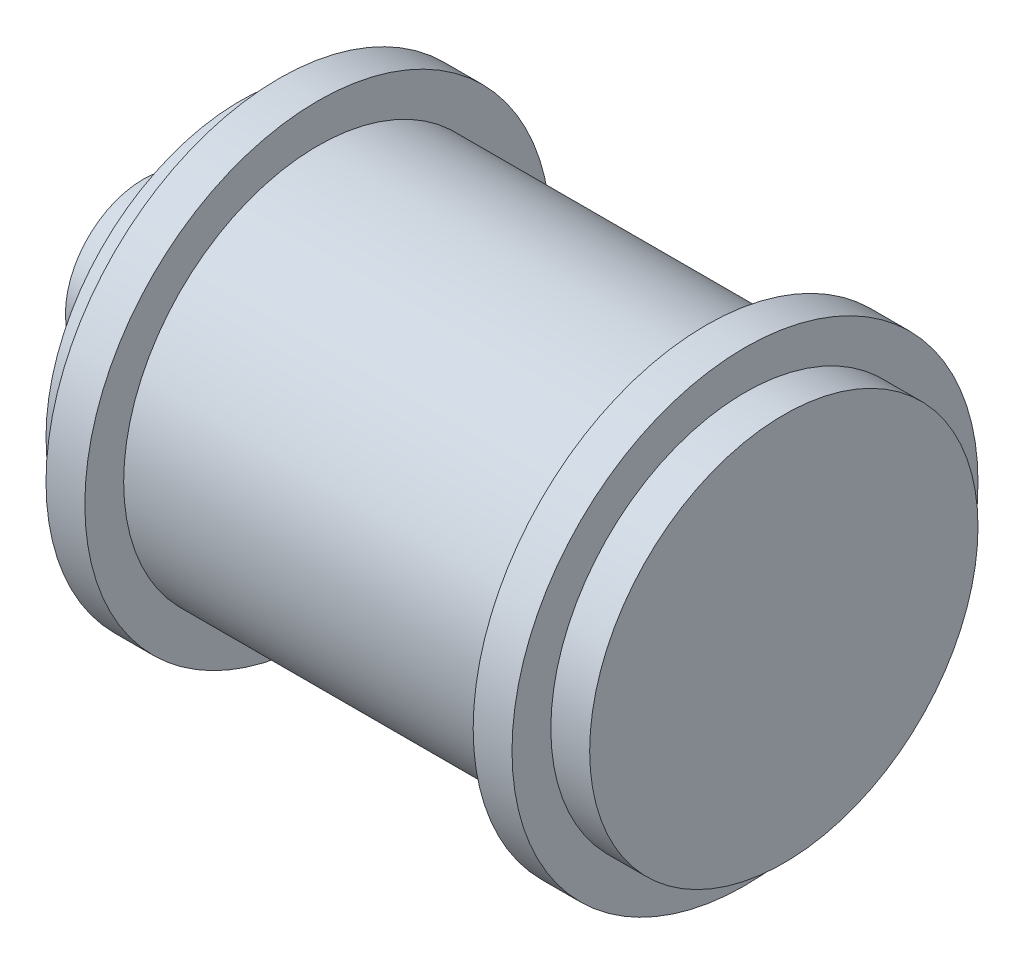
ISO-10303-21;
HEADER;
FILE_DESCRIPTION(('STEP AP214'),'2;1');
FILE_NAME('part.step','',(''),(''),'','','');
FILE_SCHEMA(('AUTOMOTIVE_DESIGN { 1 0 10303 214 1 1 1 1 }'));
ENDSEC;
DATA;
#1=APPLICATION_CONTEXT('core data for automotive mechanical design processes');
#2=APPLICATION_PROTOCOL_DEFINITION('international standard','automotive_design',2000,#1);
#3=PRODUCT_CONTEXT('',#1,'mechanical');
#4=PRODUCT('Part','Part','',(#3));
#5=PRODUCT_RELATED_PRODUCT_CATEGORY('part','',(#4));
#6=PRODUCT_DEFINITION_FORMATION('','',#4);
#7=PRODUCT_DEFINITION_CONTEXT('part definition',#1,'design');
#8=PRODUCT_DEFINITION('design','',#6,#7);
#9=PRODUCT_DEFINITION_SHAPE('','',#8);
#10=(LENGTH_UNIT() NAMED_UNIT(*) SI_UNIT(.MILLI.,.METRE.));
#11=(NAMED_UNIT(*) PLANE_ANGLE_UNIT() SI_UNIT($,.RADIAN.));
#12=(NAMED_UNIT(*) SI_UNIT($,.STERADIAN.) SOLID_ANGLE_UNIT());
#13=UNCERTAINTY_MEASURE_WITH_UNIT(LENGTH_MEASURE(1.E-05),#10,'distance_accuracy_value','');
#14=(GEOMETRIC_REPRESENTATION_CONTEXT(3) GLOBAL_UNCERTAINTY_ASSIGNED_CONTEXT((#13)) GLOBAL_UNIT_ASSIGNED_CONTEXT((#10,
#11,#12)) REPRESENTATION_CONTEXT('',''));
#15=CARTESIAN_POINT('',(0.,0.,0.));
#16=DIRECTION('',(0.,0.,1.));
#17=DIRECTION('',(1.,0.,0.));
#18=AXIS2_PLACEMENT_3D('',#15,#16,#17);
#19=CARTESIAN_POINT('',(140.,0.,0.));
#20=DIRECTION('',(-1.,0.,0.));
#21=DIRECTION('',(0.,0.,1.));
#22=AXIS2_PLACEMENT_3D('',#19,#20,#21);
#23=CYLINDRICAL_SURFACE('',#22,50.);
#24=CARTESIAN_POINT('',(10.,0.,0.));
#25=DIRECTION('',(1.,0.,0.));
#26=DIRECTION('',(0.,0.,-1.));
#27=AXIS2_PLACEMENT_3D('',#24,#25,#26);
#28=CIRCLE('',#27,50.);
#29=CARTESIAN_POINT('',(10.,0.,-50.));
#30=VERTEX_POINT('',#29);
#31=EDGE_CURVE('E43',#30,#30,#28,.T.);
#32=ORIENTED_EDGE('',*,*,#31,.F.);
#33=EDGE_LOOP('',(#32));
#34=FACE_BOUND('',#33,.T.);
#35=CARTESIAN_POINT('',(0.,0.,0.));
#36=DIRECTION('',(-1.,0.,0.));
#37=DIRECTION('',(0.,0.,1.));
#38=AXIS2_PLACEMENT_3D('',#35,#36,#37);
#39=CIRCLE('',#38,50.);
#40=CARTESIAN_POINT('',(0.,0.,50.));
#41=VERTEX_POINT('',#40);
#42=EDGE_CURVE('E34',#41,#41,#39,.T.);
#43=ORIENTED_EDGE('',*,*,#42,.F.);
#44=EDGE_LOOP('',(#43));
#45=FACE_BOUND('',#44,.T.);
#46=ADVANCED_FACE('F31',(#34,#45),#23,.T.);
#47=CARTESIAN_POINT('',(20.,0.,0.));
#48=DIRECTION('',(-1.,0.,0.));
#49=DIRECTION('',(0.,0.,1.));
#50=AXIS2_PLACEMENT_3D('',#47,#48,#49);
#51=CIRCLE('',#50,50.);
#52=CARTESIAN_POINT('',(20.,0.,50.));
#53=VERTEX_POINT('',#52);
#54=EDGE_CURVE('E72',#53,#53,#51,.T.);
#55=ORIENTED_EDGE('',*,*,#54,.F.);
#56=EDGE_LOOP('',(#55));
#57=FACE_BOUND('',#56,.T.);
#58=CARTESIAN_POINT('',(120.,0.,0.));
#59=DIRECTION('',(1.,0.,0.));
#60=DIRECTION('',(0.,0.,-1.));
#61=AXIS2_PLACEMENT_3D('',#58,#59,#60);
#62=CIRCLE('',#61,50.);
#63=CARTESIAN_POINT('',(120.,0.,-50.));
#64=VERTEX_POINT('',#63);
#65=EDGE_CURVE('E38',#64,#64,#62,.T.);
#66=ORIENTED_EDGE('',*,*,#65,.F.);
#67=EDGE_LOOP('',(#66));
#68=FACE_BOUND('',#67,.T.);
#69=ADVANCED_FACE('F82',(#57,#68),#23,.T.);
#70=CARTESIAN_POINT('',(0.,0.,0.));
#71=DIRECTION('',(-1.,0.,0.));
#72=DIRECTION('',(0.,0.,1.));
#73=AXIS2_PLACEMENT_3D('',#70,#71,#72);
#74=CYLINDRICAL_SURFACE('',#73,60.);
#75=CARTESIAN_POINT('',(10.,0.,0.));
#76=DIRECTION('',(-1.,0.,0.));
#77=DIRECTION('',(0.,0.,1.));
#78=AXIS2_PLACEMENT_3D('',#75,#76,#77);
#79=CIRCLE('',#78,60.);
#80=CARTESIAN_POINT('',(10.,0.,60.));
#81=VERTEX_POINT('',#80);
#82=EDGE_CURVE('E66',#81,#81,#79,.T.);
#83=ORIENTED_EDGE('',*,*,#82,.F.);
#84=EDGE_LOOP('',(#83));
#85=FACE_BOUND('',#84,.T.);
#86=CARTESIAN_POINT('',(20.,0.,0.));
#87=DIRECTION('',(-1.,0.,0.));
#88=DIRECTION('',(0.,0.,1.));
#89=AXIS2_PLACEMENT_3D('',#86,#87,#88);
#90=CIRCLE('',#89,60.);
#91=CARTESIAN_POINT('',(20.,0.,60.));
#92=VERTEX_POINT('',#91);
#93=EDGE_CURVE('E63',#92,#92,#90,.T.);
#94=ORIENTED_EDGE('',*,*,#93,.T.);
#95=EDGE_LOOP('',(#94));
#96=FACE_BOUND('',#95,.T.);
#97=ADVANCED_FACE('F121',(#85,#96),#74,.T.);
#98=CARTESIAN_POINT('',(10.,0.,-60.));
#99=DIRECTION('',(1.,0.,0.));
#100=DIRECTION('',(0.,0.,-1.));
#101=AXIS2_PLACEMENT_3D('',#98,#99,#100);
#102=PLANE('',#101);
#103=ORIENTED_EDGE('',*,*,#31,.T.);
#104=EDGE_LOOP('',(#103));
#105=FACE_BOUND('',#104,.T.);
#106=ORIENTED_EDGE('',*,*,#82,.T.);
#107=EDGE_LOOP('',(#106));
#108=FACE_BOUND('',#107,.T.);
#109=ADVANCED_FACE('F77',(#105,#108),#102,.F.);
#110=CARTESIAN_POINT('',(20.,0.,-60.));
#111=DIRECTION('',(-1.,0.,0.));
#112=DIRECTION('',(0.,0.,1.));
#113=AXIS2_PLACEMENT_3D('',#110,#111,#112);
#114=PLANE('',#113);
#115=ORIENTED_EDGE('',*,*,#54,.T.);
#116=EDGE_LOOP('',(#115));
#117=FACE_BOUND('',#116,.T.);
#118=ORIENTED_EDGE('',*,*,#93,.F.);
#119=EDGE_LOOP('',(#118));
#120=FACE_BOUND('',#119,.T.);
#121=ADVANCED_FACE('F115',(#117,#120),#114,.F.);
#122=CARTESIAN_POINT('',(130.,0.,-60.));
#123=DIRECTION('',(-1.,0.,0.));
#124=DIRECTION('',(0.,0.,1.));
#125=AXIS2_PLACEMENT_3D('',#122,#123,#124);
#126=PLANE('',#125);
#127=CARTESIAN_POINT('',(130.,0.,0.));
#128=DIRECTION('',(-1.,0.,0.));
#129=DIRECTION('',(0.,0.,1.));
#130=AXIS2_PLACEMENT_3D('',#127,#128,#129);
#131=CIRCLE('',#130,50.);
#132=CARTESIAN_POINT('',(130.,0.,50.));
#133=VERTEX_POINT('',#132);
#134=EDGE_CURVE('E10',#133,#133,#131,.T.);
#135=ORIENTED_EDGE('',*,*,#134,.T.);
#136=EDGE_LOOP('',(#135));
#137=FACE_BOUND('',#136,.T.);
#138=CARTESIAN_POINT('',(130.,0.,0.));
#139=DIRECTION('',(-1.,0.,0.));
#140=DIRECTION('',(0.,0.,1.));
#141=AXIS2_PLACEMENT_3D('',#138,#139,#140);
#142=CIRCLE('',#141,60.);
#143=CARTESIAN_POINT('',(130.,0.,60.));
#144=VERTEX_POINT('',#143);
#145=EDGE_CURVE('E52',#144,#144,#142,.T.);
#146=ORIENTED_EDGE('',*,*,#145,.F.);
#147=EDGE_LOOP('',(#146));
#148=FACE_BOUND('',#147,.T.);
#149=ADVANCED_FACE('F111',(#137,#148),#126,.F.);
#150=CARTESIAN_POINT('',(120.,0.,-60.));
#151=DIRECTION('',(1.,0.,0.));
#152=DIRECTION('',(0.,0.,-1.));
#153=AXIS2_PLACEMENT_3D('',#150,#151,#152);
#154=PLANE('',#153);
#155=ORIENTED_EDGE('',*,*,#65,.T.);
#156=EDGE_LOOP('',(#155));
#157=FACE_BOUND('',#156,.T.);
#158=CARTESIAN_POINT('',(120.,0.,0.));
#159=DIRECTION('',(-1.,0.,0.));
#160=DIRECTION('',(0.,0.,1.));
#161=AXIS2_PLACEMENT_3D('',#158,#159,#160);
#162=CIRCLE('',#161,60.);
#163=CARTESIAN_POINT('',(120.,0.,60.));
#164=VERTEX_POINT('',#163);
#165=EDGE_CURVE('E60',#164,#164,#162,.T.);
#166=ORIENTED_EDGE('',*,*,#165,.T.);
#167=EDGE_LOOP('',(#166));
#168=FACE_BOUND('',#167,.T.);
#169=ADVANCED_FACE('F107',(#157,#168),#154,.F.);
#170=CARTESIAN_POINT('',(0.,0.,0.));
#171=DIRECTION('',(-1.,0.,0.));
#172=DIRECTION('',(0.,0.,1.));
#173=AXIS2_PLACEMENT_3D('',#170,#171,#172);
#174=CYLINDRICAL_SURFACE('',#173,60.);
#175=ORIENTED_EDGE('',*,*,#165,.F.);
#176=EDGE_LOOP('',(#175));
#177=FACE_BOUND('',#176,.T.);
#178=ORIENTED_EDGE('',*,*,#145,.T.);
#179=EDGE_LOOP('',(#178));
#180=FACE_BOUND('',#179,.T.);
#181=ADVANCED_FACE('F104',(#177,#180),#174,.T.);
#182=CARTESIAN_POINT('',(140.,0.,0.));
#183=DIRECTION('',(1.,0.,0.));
#184=DIRECTION('',(0.,0.,-1.));
#185=AXIS2_PLACEMENT_3D('',#182,#183,#184);
#186=PLANE('',#185);
#187=CARTESIAN_POINT('',(140.,0.,0.));
#188=DIRECTION('',(1.,0.,0.));
#189=DIRECTION('',(0.,0.,-1.));
#190=AXIS2_PLACEMENT_3D('',#187,#188,#189);
#191=CIRCLE('',#190,50.);
#192=CARTESIAN_POINT('',(140.,0.,-50.));
#193=VERTEX_POINT('',#192);
#194=EDGE_CURVE('E69',#193,#193,#191,.T.);
#195=ORIENTED_EDGE('',*,*,#194,.T.);
#196=EDGE_LOOP('',(#195));
#197=FACE_BOUND('',#196,.T.);
#198=ADVANCED_FACE('F98',(#197),#186,.T.);
#199=ORIENTED_EDGE('',*,*,#194,.F.);
#200=EDGE_LOOP('',(#199));
#201=FACE_BOUND('',#200,.T.);
#202=ORIENTED_EDGE('',*,*,#134,.F.);
#203=EDGE_LOOP('',(#202));
#204=FACE_BOUND('',#203,.T.);
#205=ADVANCED_FACE('F83',(#201,#204),#23,.T.);
#206=CARTESIAN_POINT('',(0.,0.,-20.));
#207=DIRECTION('',(-1.,0.,0.));
#208=DIRECTION('',(0.,0.,1.));
#209=AXIS2_PLACEMENT_3D('',#206,#207,#208);
#210=PLANE('',#209);
#211=CARTESIAN_POINT('',(0.,0.,0.));
#212=DIRECTION('',(-1.,0.,0.));
#213=DIRECTION('',(0.,0.,1.));
#214=AXIS2_PLACEMENT_3D('',#211,#212,#213);
#215=CIRCLE('',#214,20.);
#216=CARTESIAN_POINT('',(0.,0.,20.));
#217=VERTEX_POINT('',#216);
#218=EDGE_CURVE('E48',#217,#217,#215,.T.);
#219=ORIENTED_EDGE('',*,*,#218,.F.);
#220=EDGE_LOOP('',(#219));
#221=FACE_BOUND('',#220,.T.);
#222=ORIENTED_EDGE('',*,*,#42,.T.);
#223=EDGE_LOOP('',(#222));
#224=FACE_BOUND('',#223,.T.);
#225=ADVANCED_FACE('F86',(#221,#224),#210,.T.);
#226=CARTESIAN_POINT('',(-42.7700910104139,0.,0.));
#227=DIRECTION('',(-1.,0.,0.));
#228=DIRECTION('',(0.,0.,1.));
#229=AXIS2_PLACEMENT_3D('',#226,#227,#228);
#230=CYLINDRICAL_SURFACE('',#229,20.);
#231=ORIENTED_EDGE('',*,*,#218,.T.);
#232=EDGE_LOOP('',(#231));
#233=FACE_BOUND('',#232,.T.);
#234=CARTESIAN_POINT('',(-25.,0.,0.));
#235=DIRECTION('',(1.,0.,0.));
#236=DIRECTION('',(0.,1.,0.));
#237=AXIS2_PLACEMENT_3D('',#234,#235,#236);
#238=CIRCLE('',#237,20.);
#239=CARTESIAN_POINT('',(-25.,20.,0.));
#240=VERTEX_POINT('',#239);
#241=EDGE_CURVE('E46',#240,#240,#238,.T.);
#242=ORIENTED_EDGE('',*,*,#241,.T.);
#243=EDGE_LOOP('',(#242));
#244=FACE_BOUND('',#243,.T.);
#245=ADVANCED_FACE('F88',(#233,#244),#230,.T.);
#246=CARTESIAN_POINT('',(-25.,-184.818881338036,-169.268161275));
#247=DIRECTION('',(1.,0.,0.));
#248=DIRECTION('',(0.,1.,0.));
#249=AXIS2_PLACEMENT_3D('',#246,#247,#248);
#250=PLANE('',#249);
#251=ORIENTED_EDGE('',*,*,#241,.F.);
#252=EDGE_LOOP('',(#251));
#253=FACE_BOUND('',#252,.T.);
#254=ADVANCED_FACE('F95',(#253),#250,.F.);
#255=CLOSED_SHELL('',(#46,#69,#97,#109,#121,#149,#169,#181,#198,#205,#225,#245,#254));
#256=MANIFOLD_SOLID_BREP('B2',#255);
#257=ADVANCED_BREP_SHAPE_REPRESENTATION('',(#18,#256),#14);
#258=SHAPE_DEFINITION_REPRESENTATION(#9,#257);
ENDSEC;
END-ISO-10303-21;
